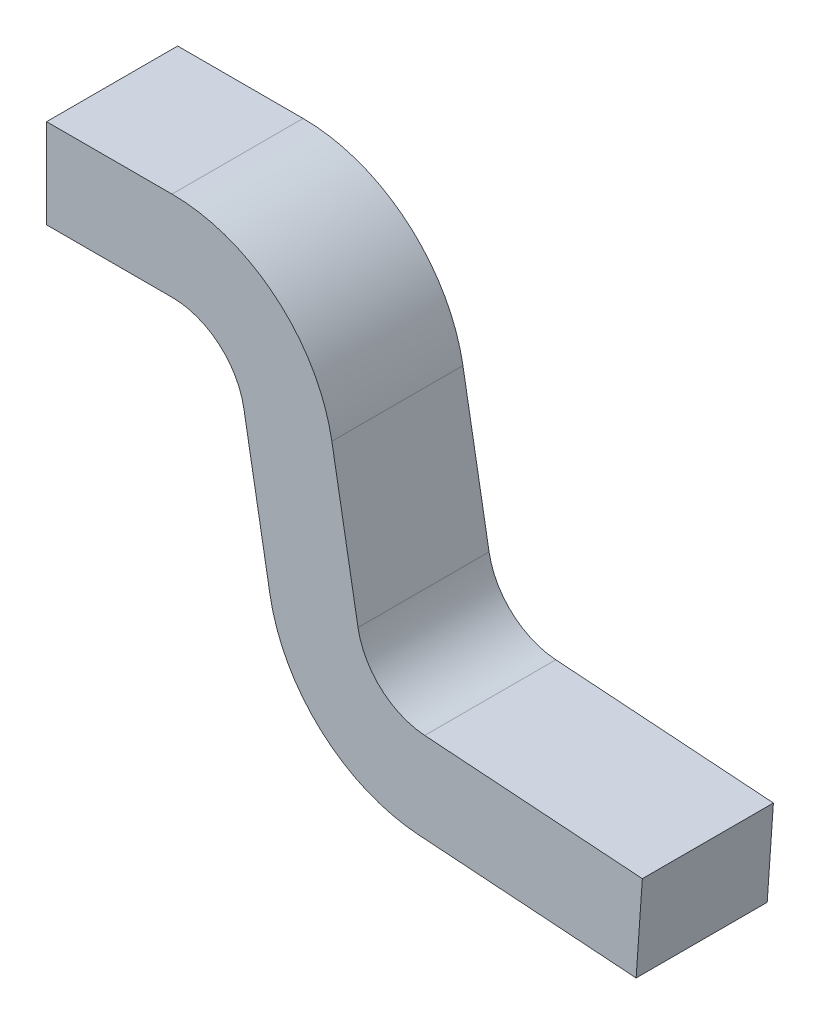
ISO-10303-21;
HEADER;
FILE_DESCRIPTION(('STEP AP214'),'2;1');
FILE_NAME('part.step','',(''),(''),'','','');
FILE_SCHEMA(('AUTOMOTIVE_DESIGN { 1 0 10303 214 1 1 1 1 }'));
ENDSEC;
DATA;
#1=APPLICATION_CONTEXT('core data for automotive mechanical design processes');
#2=APPLICATION_PROTOCOL_DEFINITION('international standard','automotive_design',2000,#1);
#3=PRODUCT_CONTEXT('',#1,'mechanical');
#4=PRODUCT('Part','Part','',(#3));
#5=PRODUCT_RELATED_PRODUCT_CATEGORY('part','',(#4));
#6=PRODUCT_DEFINITION_FORMATION('','',#4);
#7=PRODUCT_DEFINITION_CONTEXT('part definition',#1,'design');
#8=PRODUCT_DEFINITION('design','',#6,#7);
#9=PRODUCT_DEFINITION_SHAPE('','',#8);
#10=(LENGTH_UNIT() NAMED_UNIT(*) SI_UNIT(.MILLI.,.METRE.));
#11=(NAMED_UNIT(*) PLANE_ANGLE_UNIT() SI_UNIT($,.RADIAN.));
#12=(NAMED_UNIT(*) SI_UNIT($,.STERADIAN.) SOLID_ANGLE_UNIT());
#13=UNCERTAINTY_MEASURE_WITH_UNIT(LENGTH_MEASURE(1.E-05),#10,'distance_accuracy_value','');
#14=(GEOMETRIC_REPRESENTATION_CONTEXT(3) GLOBAL_UNCERTAINTY_ASSIGNED_CONTEXT((#13)) GLOBAL_UNIT_ASSIGNED_CONTEXT((#10,
#11,#12)) REPRESENTATION_CONTEXT('',''));
#15=CARTESIAN_POINT('',(0.,0.,0.));
#16=DIRECTION('',(0.,0.,1.));
#17=DIRECTION('',(1.,0.,0.));
#18=AXIS2_PLACEMENT_3D('',#15,#16,#17);
#19=CARTESIAN_POINT('',(3.05,0.75,-2.1125));
#20=DIRECTION('',(1.,0.,0.));
#21=DIRECTION('',(0.,0.,-1.));
#22=AXIS2_PLACEMENT_3D('',#19,#20,#21);
#23=PLANE('',#22);
#24=DIRECTION('',(0.,-1.,0.));
#25=VECTOR('',#24,1.);
#26=CARTESIAN_POINT('',(3.05,0.75,-2.3325));
#27=LINE('',#26,#25);
#28=CARTESIAN_POINT('',(3.05,0.75,-2.3325));
#29=VERTEX_POINT('',#28);
#30=CARTESIAN_POINT('',(3.05,0.6,-2.3325));
#31=VERTEX_POINT('',#30);
#32=EDGE_CURVE('E11',#29,#31,#27,.T.);
#33=ORIENTED_EDGE('',*,*,#32,.T.);
#34=DIRECTION('',(0.,0.,-1.));
#35=VECTOR('',#34,1.);
#36=CARTESIAN_POINT('',(3.05,0.6,-2.1125));
#37=LINE('',#36,#35);
#38=CARTESIAN_POINT('',(3.05,0.6,-2.1125));
#39=VERTEX_POINT('',#38);
#40=EDGE_CURVE('E24',#39,#31,#37,.T.);
#41=ORIENTED_EDGE('',*,*,#40,.F.);
#42=DIRECTION('',(0.,-1.,0.));
#43=VECTOR('',#42,1.);
#44=CARTESIAN_POINT('',(3.05,0.75,-2.1125));
#45=LINE('',#44,#43);
#46=CARTESIAN_POINT('',(3.05,0.75,-2.1125));
#47=VERTEX_POINT('',#46);
#48=EDGE_CURVE('E198',#47,#39,#45,.T.);
#49=ORIENTED_EDGE('',*,*,#48,.F.);
#50=DIRECTION('',(0.,0.,-1.));
#51=VECTOR('',#50,1.);
#52=CARTESIAN_POINT('',(3.05,0.75,-2.1125));
#53=LINE('',#52,#51);
#54=EDGE_CURVE('E125',#47,#29,#53,.T.);
#55=ORIENTED_EDGE('',*,*,#54,.T.);
#56=EDGE_LOOP('',(#33,#41,#49,#55));
#57=FACE_BOUND('',#56,.T.);
#58=ADVANCED_FACE('F17',(#57),#23,.F.);
#59=CARTESIAN_POINT('',(3.05,0.6,-2.1125));
#60=DIRECTION('',(0.,1.,0.));
#61=DIRECTION('',(-1.,0.,0.));
#62=AXIS2_PLACEMENT_3D('',#59,#60,#61);
#63=PLANE('',#62);
#64=DIRECTION('',(1.,0.,0.));
#65=VECTOR('',#64,1.);
#66=CARTESIAN_POINT('',(3.05,0.6,-2.3325));
#67=LINE('',#66,#65);
#68=CARTESIAN_POINT('',(3.260554706969,0.6,-2.3325));
#69=VERTEX_POINT('',#68);
#70=EDGE_CURVE('E195',#31,#69,#67,.T.);
#71=ORIENTED_EDGE('',*,*,#70,.T.);
#72=DIRECTION('',(0.,0.,-1.));
#73=VECTOR('',#72,1.);
#74=CARTESIAN_POINT('',(3.260554706969,0.6,-2.1125));
#75=LINE('',#74,#73);
#76=CARTESIAN_POINT('',(3.260554706969,0.6,-2.1125));
#77=VERTEX_POINT('',#76);
#78=EDGE_CURVE('E192',#77,#69,#75,.T.);
#79=ORIENTED_EDGE('',*,*,#78,.F.);
#80=DIRECTION('',(1.,0.,0.));
#81=VECTOR('',#80,1.);
#82=CARTESIAN_POINT('',(3.05,0.6,-2.1125));
#83=LINE('',#82,#81);
#84=EDGE_CURVE('E189',#39,#77,#83,.T.);
#85=ORIENTED_EDGE('',*,*,#84,.F.);
#86=ORIENTED_EDGE('',*,*,#40,.T.);
#87=EDGE_LOOP('',(#71,#79,#85,#86));
#88=FACE_BOUND('',#87,.T.);
#89=ADVANCED_FACE('F201',(#88),#63,.F.);
#90=CARTESIAN_POINT('',(3.260554706969,0.477570140701227,-2.1125));
#91=DIRECTION('',(0.,0.,-1.));
#92=DIRECTION('',(-1.,0.,0.));
#93=AXIS2_PLACEMENT_3D('',#90,#91,#92);
#94=CYLINDRICAL_SURFACE('',#93,0.122429859298773);
#95=CARTESIAN_POINT('',(3.260554706969,0.477570140701227,-2.3325));
#96=DIRECTION('',(0.,0.,-1.));
#97=DIRECTION('',(-1.,0.,0.));
#98=AXIS2_PLACEMENT_3D('',#95,#96,#97);
#99=CIRCLE('',#98,0.122429859298773);
#100=CARTESIAN_POINT('',(3.381124581607,0.498829862660478,-2.3325));
#101=VERTEX_POINT('',#100);
#102=EDGE_CURVE('E186',#69,#101,#99,.T.);
#103=ORIENTED_EDGE('',*,*,#102,.T.);
#104=DIRECTION('',(0.,0.,-1.));
#105=VECTOR('',#104,1.);
#106=CARTESIAN_POINT('',(3.381124581607,0.498829862660478,-2.1125));
#107=LINE('',#106,#105);
#108=CARTESIAN_POINT('',(3.381124581607,0.498829862660478,-2.1125));
#109=VERTEX_POINT('',#108);
#110=EDGE_CURVE('E184',#109,#101,#107,.T.);
#111=ORIENTED_EDGE('',*,*,#110,.F.);
#112=CARTESIAN_POINT('',(3.260554706969,0.477570140701227,-2.1125));
#113=DIRECTION('',(0.,0.,-1.));
#114=DIRECTION('',(-1.,0.,0.));
#115=AXIS2_PLACEMENT_3D('',#112,#113,#114);
#116=CIRCLE('',#115,0.122429859298773);
#117=EDGE_CURVE('E182',#77,#109,#116,.T.);
#118=ORIENTED_EDGE('',*,*,#117,.F.);
#119=ORIENTED_EDGE('',*,*,#78,.T.);
#120=EDGE_LOOP('',(#103,#111,#118,#119));
#121=FACE_BOUND('',#120,.T.);
#122=ADVANCED_FACE('F208',(#121),#94,.F.);
#123=CARTESIAN_POINT('',(3.381124581607,0.498829862660478,-2.1125));
#124=DIRECTION('',(0.984807753012208,0.173648177666931,0.));
#125=DIRECTION('',(-0.173648177666931,0.984807753012208,0.));
#126=AXIS2_PLACEMENT_3D('',#123,#124,#125);
#127=PLANE('',#126);
#128=DIRECTION('',(0.173648177666931,-0.984807753012208,0.));
#129=VECTOR('',#128,1.);
#130=CARTESIAN_POINT('',(3.381124581607,0.498829862660478,-2.3325));
#131=LINE('',#130,#129);
#132=CARTESIAN_POINT('',(3.425,0.25,-2.3325));
#133=VERTEX_POINT('',#132);
#134=EDGE_CURVE('E180',#101,#133,#131,.T.);
#135=ORIENTED_EDGE('',*,*,#134,.T.);
#136=DIRECTION('',(0.,0.,-1.));
#137=VECTOR('',#136,1.);
#138=CARTESIAN_POINT('',(3.425,0.25,-2.1125));
#139=LINE('',#138,#137);
#140=CARTESIAN_POINT('',(3.425,0.25,-2.1125));
#141=VERTEX_POINT('',#140);
#142=EDGE_CURVE('E177',#141,#133,#139,.T.);
#143=ORIENTED_EDGE('',*,*,#142,.F.);
#144=DIRECTION('',(0.173648177666931,-0.984807753012208,0.));
#145=VECTOR('',#144,1.);
#146=CARTESIAN_POINT('',(3.381124581607,0.498829862660478,-2.1125));
#147=LINE('',#146,#145);
#148=EDGE_CURVE('E174',#109,#141,#147,.T.);
#149=ORIENTED_EDGE('',*,*,#148,.F.);
#150=ORIENTED_EDGE('',*,*,#110,.T.);
#151=EDGE_LOOP('',(#135,#143,#149,#150));
#152=FACE_BOUND('',#151,.T.);
#153=ADVANCED_FACE('F235',(#152),#127,.F.);
#154=CARTESIAN_POINT('',(3.693291037589,0.29730694860929,-2.1125));
#155=DIRECTION('',(0.,0.,-1.));
#156=DIRECTION('',(-1.,0.,0.));
#157=AXIS2_PLACEMENT_3D('',#154,#155,#156);
#158=CYLINDRICAL_SURFACE('',#157,0.272429859298773);
#159=CARTESIAN_POINT('',(3.693291037589,0.29730694860929,-2.3325));
#160=DIRECTION('',(0.,0.,1.));
#161=DIRECTION('',(1.,0.,0.));
#162=AXIS2_PLACEMENT_3D('',#159,#160,#161);
#163=CIRCLE('',#162,0.272429859298772);
#164=CARTESIAN_POINT('',(3.674287291262,0.0255407147554925,-2.3325));
#165=VERTEX_POINT('',#164);
#166=EDGE_CURVE('E172',#133,#165,#163,.T.);
#167=ORIENTED_EDGE('',*,*,#166,.T.);
#168=DIRECTION('',(0.,0.,-1.));
#169=VECTOR('',#168,1.);
#170=CARTESIAN_POINT('',(3.674287291262,0.0255407147554925,-2.1125));
#171=LINE('',#170,#169);
#172=CARTESIAN_POINT('',(3.674287291262,0.0255407147554925,-2.1125));
#173=VERTEX_POINT('',#172);
#174=EDGE_CURVE('E169',#173,#165,#171,.T.);
#175=ORIENTED_EDGE('',*,*,#174,.F.);
#176=CARTESIAN_POINT('',(3.693291037589,0.29730694860929,-2.1125));
#177=DIRECTION('',(0.,0.,1.));
#178=DIRECTION('',(1.,0.,0.));
#179=AXIS2_PLACEMENT_3D('',#176,#177,#178);
#180=CIRCLE('',#179,0.272429859298773);
#181=EDGE_CURVE('E166',#141,#173,#180,.T.);
#182=ORIENTED_EDGE('',*,*,#181,.F.);
#183=ORIENTED_EDGE('',*,*,#142,.T.);
#184=EDGE_LOOP('',(#167,#175,#182,#183));
#185=FACE_BOUND('',#184,.T.);
#186=ADVANCED_FACE('F233',(#185),#158,.T.);
#187=CARTESIAN_POINT('',(3.674287291262,0.0255407147554925,-2.1125));
#188=DIRECTION('',(0.069756473744118,0.997564050259825,0.));
#189=DIRECTION('',(-0.997564050259825,0.069756473744118,0.));
#190=AXIS2_PLACEMENT_3D('',#187,#188,#189);
#191=PLANE('',#190);
#192=DIRECTION('',(0.997564050259825,-0.069756473744118,0.));
#193=VECTOR('',#192,1.);
#194=CARTESIAN_POINT('',(3.674287291262,0.0255407147554925,-2.3325));
#195=LINE('',#194,#193);
#196=CARTESIAN_POINT('',(4.039536528938,0.,-2.3325));
#197=VERTEX_POINT('',#196);
#198=EDGE_CURVE('E164',#165,#197,#195,.T.);
#199=ORIENTED_EDGE('',*,*,#198,.T.);
#200=DIRECTION('',(0.,0.,-1.));
#201=VECTOR('',#200,1.);
#202=CARTESIAN_POINT('',(4.039536528938,0.,-2.1125));
#203=LINE('',#202,#201);
#204=CARTESIAN_POINT('',(4.039536528938,0.,-2.1125));
#205=VERTEX_POINT('',#204);
#206=EDGE_CURVE('E161',#205,#197,#203,.T.);
#207=ORIENTED_EDGE('',*,*,#206,.F.);
#208=DIRECTION('',(0.997564050259825,-0.069756473744118,0.));
#209=VECTOR('',#208,1.);
#210=CARTESIAN_POINT('',(3.674287291262,0.0255407147554925,-2.1125));
#211=LINE('',#210,#209);
#212=EDGE_CURVE('E158',#173,#205,#211,.T.);
#213=ORIENTED_EDGE('',*,*,#212,.F.);
#214=ORIENTED_EDGE('',*,*,#174,.T.);
#215=EDGE_LOOP('',(#199,#207,#213,#214));
#216=FACE_BOUND('',#215,.T.);
#217=ADVANCED_FACE('F230',(#216),#191,.F.);
#218=CARTESIAN_POINT('',(4.05,0.149634607538973,-2.1125));
#219=DIRECTION('',(-0.997564050259825,0.069756473744115,0.));
#220=DIRECTION('',(-0.069756473744115,-0.997564050259825,0.));
#221=AXIS2_PLACEMENT_3D('',#218,#219,#220);
#222=PLANE('',#221);
#223=DIRECTION('',(0.069756473744115,0.997564050259825,0.));
#224=VECTOR('',#223,1.);
#225=CARTESIAN_POINT('',(4.05,0.149634607538973,-2.3325));
#226=LINE('',#225,#224);
#227=CARTESIAN_POINT('',(4.05,0.149634607538973,-2.3325));
#228=VERTEX_POINT('',#227);
#229=EDGE_CURVE('E156',#197,#228,#226,.T.);
#230=ORIENTED_EDGE('',*,*,#229,.T.);
#231=DIRECTION('',(0.,0.,-1.));
#232=VECTOR('',#231,1.);
#233=CARTESIAN_POINT('',(4.05,0.149634607538973,-2.1125));
#234=LINE('',#233,#232);
#235=CARTESIAN_POINT('',(4.05,0.149634607538973,-2.1125));
#236=VERTEX_POINT('',#235);
#237=EDGE_CURVE('E153',#236,#228,#234,.T.);
#238=ORIENTED_EDGE('',*,*,#237,.F.);
#239=DIRECTION('',(0.069756473744115,0.997564050259825,0.));
#240=VECTOR('',#239,1.);
#241=CARTESIAN_POINT('',(4.05,0.149634607538973,-2.1125));
#242=LINE('',#241,#240);
#243=EDGE_CURVE('E150',#205,#236,#242,.T.);
#244=ORIENTED_EDGE('',*,*,#243,.F.);
#245=ORIENTED_EDGE('',*,*,#206,.T.);
#246=EDGE_LOOP('',(#230,#238,#244,#245));
#247=FACE_BOUND('',#246,.T.);
#248=ADVANCED_FACE('F226',(#247),#222,.F.);
#249=CARTESIAN_POINT('',(3.684750762324,0.175175322294466,-2.1125));
#250=DIRECTION('',(-0.069756473744119,-0.997564050259825,0.));
#251=DIRECTION('',(0.997564050259825,-0.069756473744119,0.));
#252=AXIS2_PLACEMENT_3D('',#249,#250,#251);
#253=PLANE('',#252);
#254=DIRECTION('',(-0.997564050259825,0.069756473744119,0.));
#255=VECTOR('',#254,1.);
#256=CARTESIAN_POINT('',(3.684750762324,0.175175322294466,-2.3325));
#257=LINE('',#256,#255);
#258=CARTESIAN_POINT('',(3.684750762324,0.175175322294466,-2.3325));
#259=VERTEX_POINT('',#258);
#260=EDGE_CURVE('E148',#228,#259,#257,.T.);
#261=ORIENTED_EDGE('',*,*,#260,.T.);
#262=DIRECTION('',(0.,0.,-1.));
#263=VECTOR('',#262,1.);
#264=CARTESIAN_POINT('',(3.684750762324,0.175175322294466,-2.1125));
#265=LINE('',#264,#263);
#266=CARTESIAN_POINT('',(3.684750762324,0.175175322294466,-2.1125));
#267=VERTEX_POINT('',#266);
#268=EDGE_CURVE('E145',#267,#259,#265,.T.);
#269=ORIENTED_EDGE('',*,*,#268,.F.);
#270=DIRECTION('',(-0.997564050259825,0.069756473744119,0.));
#271=VECTOR('',#270,1.);
#272=CARTESIAN_POINT('',(3.684750762324,0.175175322294466,-2.1125));
#273=LINE('',#272,#271);
#274=EDGE_CURVE('E142',#236,#267,#273,.T.);
#275=ORIENTED_EDGE('',*,*,#274,.F.);
#276=ORIENTED_EDGE('',*,*,#237,.T.);
#277=EDGE_LOOP('',(#261,#269,#275,#276));
#278=FACE_BOUND('',#277,.T.);
#279=ADVANCED_FACE('F222',(#278),#253,.F.);
#280=CARTESIAN_POINT('',(3.693291037589,0.29730694860929,-2.1125));
#281=DIRECTION('',(0.,0.,-1.));
#282=DIRECTION('',(-1.,0.,0.));
#283=AXIS2_PLACEMENT_3D('',#280,#281,#282);
#284=CYLINDRICAL_SURFACE('',#283,0.122429859298773);
#285=CARTESIAN_POINT('',(3.693291037589,0.29730694860929,-2.3325));
#286=DIRECTION('',(0.,0.,-1.));
#287=DIRECTION('',(1.,0.,0.));
#288=AXIS2_PLACEMENT_3D('',#285,#286,#287);
#289=CIRCLE('',#288,0.122429859298773);
#290=CARTESIAN_POINT('',(3.572721162952,0.276047226650039,-2.3325));
#291=VERTEX_POINT('',#290);
#292=EDGE_CURVE('E139',#259,#291,#289,.T.);
#293=ORIENTED_EDGE('',*,*,#292,.T.);
#294=DIRECTION('',(0.,0.,-1.));
#295=VECTOR('',#294,1.);
#296=CARTESIAN_POINT('',(3.572721162952,0.276047226650039,-2.1125));
#297=LINE('',#296,#295);
#298=CARTESIAN_POINT('',(3.572721162952,0.276047226650039,-2.1125));
#299=VERTEX_POINT('',#298);
#300=EDGE_CURVE('E137',#299,#291,#297,.T.);
#301=ORIENTED_EDGE('',*,*,#300,.F.);
#302=CARTESIAN_POINT('',(3.693291037589,0.29730694860929,-2.1125));
#303=DIRECTION('',(0.,0.,-1.));
#304=DIRECTION('',(1.,0.,0.));
#305=AXIS2_PLACEMENT_3D('',#302,#303,#304);
#306=CIRCLE('',#305,0.122429859298773);
#307=EDGE_CURVE('E135',#267,#299,#306,.T.);
#308=ORIENTED_EDGE('',*,*,#307,.F.);
#309=ORIENTED_EDGE('',*,*,#268,.T.);
#310=EDGE_LOOP('',(#293,#301,#308,#309));
#311=FACE_BOUND('',#310,.T.);
#312=ADVANCED_FACE('F219',(#311),#284,.F.);
#313=CARTESIAN_POINT('',(3.528845744559,0.524877089310517,-2.1125));
#314=DIRECTION('',(-0.984807753012208,-0.173648177666929,0.));
#315=DIRECTION('',(0.173648177666929,-0.984807753012208,0.));
#316=AXIS2_PLACEMENT_3D('',#313,#314,#315);
#317=PLANE('',#316);
#318=DIRECTION('',(-0.173648177666929,0.984807753012208,0.));
#319=VECTOR('',#318,1.);
#320=CARTESIAN_POINT('',(3.528845744559,0.524877089310517,-2.3325));
#321=LINE('',#320,#319);
#322=CARTESIAN_POINT('',(3.528845744559,0.524877089310517,-2.3325));
#323=VERTEX_POINT('',#322);
#324=EDGE_CURVE('E133',#291,#323,#321,.T.);
#325=ORIENTED_EDGE('',*,*,#324,.T.);
#326=DIRECTION('',(0.,0.,-1.));
#327=VECTOR('',#326,1.);
#328=CARTESIAN_POINT('',(3.528845744559,0.524877089310517,-2.1125));
#329=LINE('',#328,#327);
#330=CARTESIAN_POINT('',(3.528845744559,0.524877089310517,-2.1125));
#331=VERTEX_POINT('',#330);
#332=EDGE_CURVE('E131',#331,#323,#329,.T.);
#333=ORIENTED_EDGE('',*,*,#332,.F.);
#334=DIRECTION('',(-0.173648177666929,0.984807753012208,0.));
#335=VECTOR('',#334,1.);
#336=CARTESIAN_POINT('',(3.528845744559,0.524877089310517,-2.1125));
#337=LINE('',#336,#335);
#338=EDGE_CURVE('E120',#299,#331,#337,.T.);
#339=ORIENTED_EDGE('',*,*,#338,.F.);
#340=ORIENTED_EDGE('',*,*,#300,.T.);
#341=EDGE_LOOP('',(#325,#333,#339,#340));
#342=FACE_BOUND('',#341,.T.);
#343=ADVANCED_FACE('F215',(#342),#317,.F.);
#344=CARTESIAN_POINT('',(3.260554706969,0.477570140701227,-2.1125));
#345=DIRECTION('',(0.,0.,-1.));
#346=DIRECTION('',(-1.,0.,0.));
#347=AXIS2_PLACEMENT_3D('',#344,#345,#346);
#348=CYLINDRICAL_SURFACE('',#347,0.272429859298773);
#349=CARTESIAN_POINT('',(3.260554706969,0.477570140701227,-2.3325));
#350=DIRECTION('',(0.,0.,1.));
#351=DIRECTION('',(-1.,0.,0.));
#352=AXIS2_PLACEMENT_3D('',#349,#350,#351);
#353=CIRCLE('',#352,0.272429859298773);
#354=CARTESIAN_POINT('',(3.260554706969,0.75,-2.3325));
#355=VERTEX_POINT('',#354);
#356=EDGE_CURVE('E108',#323,#355,#353,.T.);
#357=ORIENTED_EDGE('',*,*,#356,.T.);
#358=DIRECTION('',(0.,0.,-1.));
#359=VECTOR('',#358,1.);
#360=CARTESIAN_POINT('',(3.260554706969,0.75,-2.1125));
#361=LINE('',#360,#359);
#362=CARTESIAN_POINT('',(3.260554706969,0.75,-2.1125));
#363=VERTEX_POINT('',#362);
#364=EDGE_CURVE('E102',#363,#355,#361,.T.);
#365=ORIENTED_EDGE('',*,*,#364,.F.);
#366=CARTESIAN_POINT('',(3.260554706969,0.477570140701227,-2.1125));
#367=DIRECTION('',(0.,0.,1.));
#368=DIRECTION('',(-1.,0.,0.));
#369=AXIS2_PLACEMENT_3D('',#366,#367,#368);
#370=CIRCLE('',#369,0.272429859298773);
#371=EDGE_CURVE('E106',#331,#363,#370,.T.);
#372=ORIENTED_EDGE('',*,*,#371,.F.);
#373=ORIENTED_EDGE('',*,*,#332,.T.);
#374=EDGE_LOOP('',(#357,#365,#372,#373));
#375=FACE_BOUND('',#374,.T.);
#376=ADVANCED_FACE('F104',(#375),#348,.T.);
#377=CARTESIAN_POINT('',(3.05,0.75,-2.1125));
#378=DIRECTION('',(0.,-1.,0.));
#379=DIRECTION('',(1.,0.,0.));
#380=AXIS2_PLACEMENT_3D('',#377,#378,#379);
#381=PLANE('',#380);
#382=DIRECTION('',(-1.,0.,0.));
#383=VECTOR('',#382,1.);
#384=CARTESIAN_POINT('',(3.05,0.75,-2.3325));
#385=LINE('',#384,#383);
#386=EDGE_CURVE('E121',#355,#29,#385,.T.);
#387=ORIENTED_EDGE('',*,*,#386,.T.);
#388=ORIENTED_EDGE('',*,*,#54,.F.);
#389=DIRECTION('',(-1.,0.,0.));
#390=VECTOR('',#389,1.);
#391=CARTESIAN_POINT('',(3.05,0.75,-2.1125));
#392=LINE('',#391,#390);
#393=EDGE_CURVE('E118',#363,#47,#392,.T.);
#394=ORIENTED_EDGE('',*,*,#393,.F.);
#395=ORIENTED_EDGE('',*,*,#364,.T.);
#396=EDGE_LOOP('',(#387,#388,#394,#395));
#397=FACE_BOUND('',#396,.T.);
#398=ADVANCED_FACE('F124',(#397),#381,.F.);
#399=CARTESIAN_POINT('',(3.260554706969,0.477570140701227,-2.1125));
#400=DIRECTION('',(0.,0.,-1.));
#401=DIRECTION('',(-1.,0.,0.));
#402=AXIS2_PLACEMENT_3D('',#399,#400,#401);
#403=PLANE('',#402);
#404=ORIENTED_EDGE('',*,*,#48,.T.);
#405=ORIENTED_EDGE('',*,*,#84,.T.);
#406=ORIENTED_EDGE('',*,*,#117,.T.);
#407=ORIENTED_EDGE('',*,*,#148,.T.);
#408=ORIENTED_EDGE('',*,*,#181,.T.);
#409=ORIENTED_EDGE('',*,*,#212,.T.);
#410=ORIENTED_EDGE('',*,*,#243,.T.);
#411=ORIENTED_EDGE('',*,*,#274,.T.);
#412=ORIENTED_EDGE('',*,*,#307,.T.);
#413=ORIENTED_EDGE('',*,*,#338,.T.);
#414=ORIENTED_EDGE('',*,*,#371,.T.);
#415=ORIENTED_EDGE('',*,*,#393,.T.);
#416=EDGE_LOOP('',(#404,#405,#406,#407,#408,#409,#410,#411,#412,#413,#414,#415));
#417=FACE_BOUND('',#416,.T.);
#418=ADVANCED_FACE('F117',(#417),#403,.F.);
#419=CARTESIAN_POINT('',(3.260554706969,0.477570140701227,-2.3325));
#420=DIRECTION('',(0.,0.,-1.));
#421=DIRECTION('',(-1.,0.,0.));
#422=AXIS2_PLACEMENT_3D('',#419,#420,#421);
#423=PLANE('',#422);
#424=ORIENTED_EDGE('',*,*,#32,.F.);
#425=ORIENTED_EDGE('',*,*,#386,.F.);
#426=ORIENTED_EDGE('',*,*,#356,.F.);
#427=ORIENTED_EDGE('',*,*,#324,.F.);
#428=ORIENTED_EDGE('',*,*,#292,.F.);
#429=ORIENTED_EDGE('',*,*,#260,.F.);
#430=ORIENTED_EDGE('',*,*,#229,.F.);
#431=ORIENTED_EDGE('',*,*,#198,.F.);
#432=ORIENTED_EDGE('',*,*,#166,.F.);
#433=ORIENTED_EDGE('',*,*,#134,.F.);
#434=ORIENTED_EDGE('',*,*,#102,.F.);
#435=ORIENTED_EDGE('',*,*,#70,.F.);
#436=EDGE_LOOP('',(#424,#425,#426,#427,#428,#429,#430,#431,#432,#433,#434,#435));
#437=FACE_BOUND('',#436,.T.);
#438=ADVANCED_FACE('F203',(#437),#423,.T.);
#439=CLOSED_SHELL('',(#58,#89,#122,#153,#186,#217,#248,#279,#312,#343,#376,#398,#418,#438));
#440=MANIFOLD_SOLID_BREP('B1',#439);
#441=ADVANCED_BREP_SHAPE_REPRESENTATION('',(#18,#440),#14);
#442=SHAPE_DEFINITION_REPRESENTATION(#9,#441);
ENDSEC;
END-ISO-10303-21;
